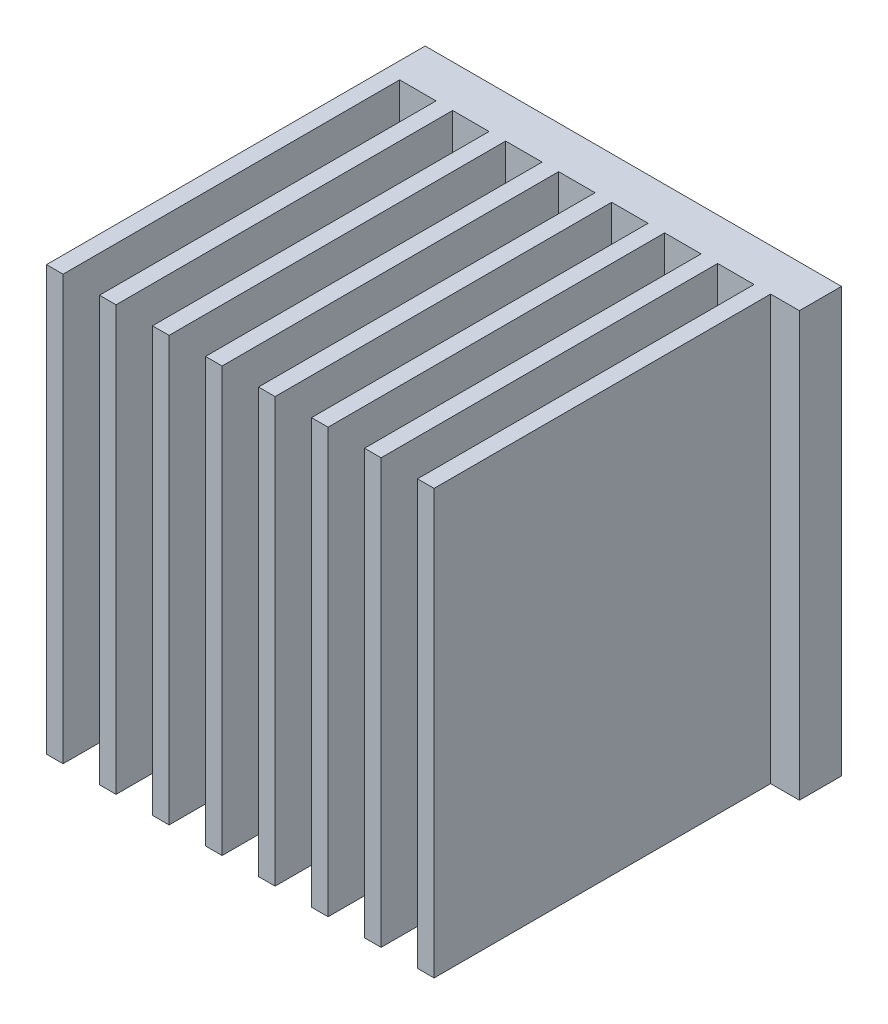
ISO-10303-21;
HEADER;
FILE_DESCRIPTION(('STEP AP214'),'2;1');
FILE_NAME('part.step','',(''),(''),'','','');
FILE_SCHEMA(('AUTOMOTIVE_DESIGN { 1 0 10303 214 1 1 1 1 }'));
ENDSEC;
DATA;
#1=APPLICATION_CONTEXT('core data for automotive mechanical design processes');
#2=APPLICATION_PROTOCOL_DEFINITION('international standard','automotive_design',2000,#1);
#3=PRODUCT_CONTEXT('',#1,'mechanical');
#4=PRODUCT('Part','Part','',(#3));
#5=PRODUCT_RELATED_PRODUCT_CATEGORY('part','',(#4));
#6=PRODUCT_DEFINITION_FORMATION('','',#4);
#7=PRODUCT_DEFINITION_CONTEXT('part definition',#1,'design');
#8=PRODUCT_DEFINITION('design','',#6,#7);
#9=PRODUCT_DEFINITION_SHAPE('','',#8);
#10=(LENGTH_UNIT() NAMED_UNIT(*) SI_UNIT(.MILLI.,.METRE.));
#11=(NAMED_UNIT(*) PLANE_ANGLE_UNIT() SI_UNIT($,.RADIAN.));
#12=(NAMED_UNIT(*) SI_UNIT($,.STERADIAN.) SOLID_ANGLE_UNIT());
#13=UNCERTAINTY_MEASURE_WITH_UNIT(LENGTH_MEASURE(1.E-05),#10,'distance_accuracy_value','');
#14=(GEOMETRIC_REPRESENTATION_CONTEXT(3) GLOBAL_UNCERTAINTY_ASSIGNED_CONTEXT((#13)) GLOBAL_UNIT_ASSIGNED_CONTEXT((#10,
#11,#12)) REPRESENTATION_CONTEXT('',''));
#15=CARTESIAN_POINT('',(0.,0.,0.));
#16=DIRECTION('',(0.,0.,1.));
#17=DIRECTION('',(1.,0.,0.));
#18=AXIS2_PLACEMENT_3D('',#15,#16,#17);
#19=CARTESIAN_POINT('',(0.,0.,3.175));
#20=DIRECTION('',(0.,0.,-1.));
#21=DIRECTION('',(-1.,0.,0.));
#22=AXIS2_PLACEMENT_3D('',#19,#20,#21);
#23=PLANE('',#22);
#24=DIRECTION('',(0.,-1.,0.));
#25=VECTOR('',#24,1.);
#26=CARTESIAN_POINT('',(12.29,16.,3.175));
#27=LINE('',#26,#25);
#28=CARTESIAN_POINT('',(12.29,16.,3.175));
#29=VERTEX_POINT('',#28);
#30=CARTESIAN_POINT('',(12.29,-16.,3.175));
#31=VERTEX_POINT('',#30);
#32=EDGE_CURVE('E60',#29,#31,#27,.T.);
#33=ORIENTED_EDGE('',*,*,#32,.F.);
#34=DIRECTION('',(-1.,0.,0.));
#35=VECTOR('',#34,1.);
#36=CARTESIAN_POINT('',(-15.71,16.,3.175));
#37=LINE('',#36,#35);
#38=CARTESIAN_POINT('',(9.54,16.,3.175));
#39=VERTEX_POINT('',#38);
#40=EDGE_CURVE('E482',#29,#39,#37,.T.);
#41=ORIENTED_EDGE('',*,*,#40,.T.);
#42=DIRECTION('',(0.,1.,0.));
#43=VECTOR('',#42,1.);
#44=CARTESIAN_POINT('',(9.53999999999999,16.,3.175));
#45=LINE('',#44,#43);
#46=CARTESIAN_POINT('',(9.54,-16.,3.175));
#47=VERTEX_POINT('',#46);
#48=EDGE_CURVE('E292',#47,#39,#45,.T.);
#49=ORIENTED_EDGE('',*,*,#48,.F.);
#50=DIRECTION('',(1.,0.,0.));
#51=VECTOR('',#50,1.);
#52=CARTESIAN_POINT('',(-15.71,-16.,3.175));
#53=LINE('',#52,#51);
#54=EDGE_CURVE('E515',#47,#31,#53,.T.);
#55=ORIENTED_EDGE('',*,*,#54,.T.);
#56=EDGE_LOOP('',(#33,#41,#49,#55));
#57=FACE_BOUND('',#56,.T.);
#58=ADVANCED_FACE('F45',(#57),#23,.F.);
#59=DIRECTION('',(0.,1.,0.));
#60=VECTOR('',#59,1.);
#61=CARTESIAN_POINT('',(13.54,16.,3.175));
#62=LINE('',#61,#60);
#63=CARTESIAN_POINT('',(13.54,-16.,3.175));
#64=VERTEX_POINT('',#63);
#65=CARTESIAN_POINT('',(13.54,16.,3.175));
#66=VERTEX_POINT('',#65);
#67=EDGE_CURVE('E286',#64,#66,#62,.T.);
#68=ORIENTED_EDGE('',*,*,#67,.F.);
#69=CARTESIAN_POINT('',(15.71,-16.,3.175));
#70=VERTEX_POINT('',#69);
#71=EDGE_CURVE('E481',#64,#70,#53,.T.);
#72=ORIENTED_EDGE('',*,*,#71,.T.);
#73=DIRECTION('',(0.,1.,0.));
#74=VECTOR('',#73,1.);
#75=CARTESIAN_POINT('',(15.71,-16.,3.175));
#76=LINE('',#75,#74);
#77=CARTESIAN_POINT('',(15.71,16.,3.175));
#78=VERTEX_POINT('',#77);
#79=EDGE_CURVE('E476',#70,#78,#76,.T.);
#80=ORIENTED_EDGE('',*,*,#79,.T.);
#81=EDGE_CURVE('E68',#78,#66,#37,.T.);
#82=ORIENTED_EDGE('',*,*,#81,.T.);
#83=EDGE_LOOP('',(#68,#72,#80,#82));
#84=FACE_BOUND('',#83,.T.);
#85=ADVANCED_FACE('F514',(#84),#23,.F.);
#86=DIRECTION('',(0.,-1.,0.));
#87=VECTOR('',#86,1.);
#88=CARTESIAN_POINT('',(8.29,16.,3.175));
#89=LINE('',#88,#87);
#90=CARTESIAN_POINT('',(8.29,16.,3.175));
#91=VERTEX_POINT('',#90);
#92=CARTESIAN_POINT('',(8.29,-16.,3.175));
#93=VERTEX_POINT('',#92);
#94=EDGE_CURVE('E289',#91,#93,#89,.T.);
#95=ORIENTED_EDGE('',*,*,#94,.F.);
#96=CARTESIAN_POINT('',(5.54,16.,3.175));
#97=VERTEX_POINT('',#96);
#98=EDGE_CURVE('E618',#91,#97,#37,.T.);
#99=ORIENTED_EDGE('',*,*,#98,.T.);
#100=DIRECTION('',(0.,1.,0.));
#101=VECTOR('',#100,1.);
#102=CARTESIAN_POINT('',(5.53999999999999,16.,3.175));
#103=LINE('',#102,#101);
#104=CARTESIAN_POINT('',(5.54,-16.,3.175));
#105=VERTEX_POINT('',#104);
#106=EDGE_CURVE('E326',#105,#97,#103,.T.);
#107=ORIENTED_EDGE('',*,*,#106,.F.);
#108=EDGE_CURVE('E516',#105,#93,#53,.T.);
#109=ORIENTED_EDGE('',*,*,#108,.T.);
#110=EDGE_LOOP('',(#95,#99,#107,#109));
#111=FACE_BOUND('',#110,.T.);
#112=ADVANCED_FACE('F582',(#111),#23,.F.);
#113=DIRECTION('',(0.,-1.,0.));
#114=VECTOR('',#113,1.);
#115=CARTESIAN_POINT('',(4.29,16.,3.175));
#116=LINE('',#115,#114);
#117=CARTESIAN_POINT('',(4.29,16.,3.175));
#118=VERTEX_POINT('',#117);
#119=CARTESIAN_POINT('',(4.29,-16.,3.175));
#120=VERTEX_POINT('',#119);
#121=EDGE_CURVE('E321',#118,#120,#116,.T.);
#122=ORIENTED_EDGE('',*,*,#121,.F.);
#123=CARTESIAN_POINT('',(1.54,16.,3.175));
#124=VERTEX_POINT('',#123);
#125=EDGE_CURVE('E617',#118,#124,#37,.T.);
#126=ORIENTED_EDGE('',*,*,#125,.T.);
#127=DIRECTION('',(0.,1.,0.));
#128=VECTOR('',#127,1.);
#129=CARTESIAN_POINT('',(1.53999999999999,16.,3.175));
#130=LINE('',#129,#128);
#131=CARTESIAN_POINT('',(1.54,-16.,3.175));
#132=VERTEX_POINT('',#131);
#133=EDGE_CURVE('E353',#132,#124,#130,.T.);
#134=ORIENTED_EDGE('',*,*,#133,.F.);
#135=EDGE_CURVE('E518',#132,#120,#53,.T.);
#136=ORIENTED_EDGE('',*,*,#135,.T.);
#137=EDGE_LOOP('',(#122,#126,#134,#136));
#138=FACE_BOUND('',#137,.T.);
#139=ADVANCED_FACE('F599',(#138),#23,.F.);
#140=DIRECTION('',(0.,-1.,0.));
#141=VECTOR('',#140,1.);
#142=CARTESIAN_POINT('',(0.289999999999995,16.,3.175));
#143=LINE('',#142,#141);
#144=CARTESIAN_POINT('',(0.289999999999995,16.,3.175));
#145=VERTEX_POINT('',#144);
#146=CARTESIAN_POINT('',(0.289999999999995,-16.,3.175));
#147=VERTEX_POINT('',#146);
#148=EDGE_CURVE('E348',#145,#147,#143,.T.);
#149=ORIENTED_EDGE('',*,*,#148,.F.);
#150=CARTESIAN_POINT('',(-2.46,16.,3.175));
#151=VERTEX_POINT('',#150);
#152=EDGE_CURVE('E546',#145,#151,#37,.T.);
#153=ORIENTED_EDGE('',*,*,#152,.T.);
#154=DIRECTION('',(0.,1.,0.));
#155=VECTOR('',#154,1.);
#156=CARTESIAN_POINT('',(-2.46000000000001,16.,3.175));
#157=LINE('',#156,#155);
#158=CARTESIAN_POINT('',(-2.46,-16.,3.175));
#159=VERTEX_POINT('',#158);
#160=EDGE_CURVE('E380',#159,#151,#157,.T.);
#161=ORIENTED_EDGE('',*,*,#160,.F.);
#162=EDGE_CURVE('E521',#159,#147,#53,.T.);
#163=ORIENTED_EDGE('',*,*,#162,.T.);
#164=EDGE_LOOP('',(#149,#153,#161,#163));
#165=FACE_BOUND('',#164,.T.);
#166=ADVANCED_FACE('F595',(#165),#23,.F.);
#167=DIRECTION('',(0.,-1.,0.));
#168=VECTOR('',#167,1.);
#169=CARTESIAN_POINT('',(-3.71,16.,3.175));
#170=LINE('',#169,#168);
#171=CARTESIAN_POINT('',(-3.71,16.,3.175));
#172=VERTEX_POINT('',#171);
#173=CARTESIAN_POINT('',(-3.71,-16.,3.175));
#174=VERTEX_POINT('',#173);
#175=EDGE_CURVE('E375',#172,#174,#170,.T.);
#176=ORIENTED_EDGE('',*,*,#175,.F.);
#177=CARTESIAN_POINT('',(-6.46,16.,3.175));
#178=VERTEX_POINT('',#177);
#179=EDGE_CURVE('E545',#172,#178,#37,.T.);
#180=ORIENTED_EDGE('',*,*,#179,.T.);
#181=DIRECTION('',(0.,1.,0.));
#182=VECTOR('',#181,1.);
#183=CARTESIAN_POINT('',(-6.46000000000001,16.,3.175));
#184=LINE('',#183,#182);
#185=CARTESIAN_POINT('',(-6.46,-16.,3.175));
#186=VERTEX_POINT('',#185);
#187=EDGE_CURVE('E407',#186,#178,#184,.T.);
#188=ORIENTED_EDGE('',*,*,#187,.F.);
#189=EDGE_CURVE('E524',#186,#174,#53,.T.);
#190=ORIENTED_EDGE('',*,*,#189,.T.);
#191=EDGE_LOOP('',(#176,#180,#188,#190));
#192=FACE_BOUND('',#191,.T.);
#193=ADVANCED_FACE('F591',(#192),#23,.F.);
#194=DIRECTION('',(0.,-1.,0.));
#195=VECTOR('',#194,1.);
#196=CARTESIAN_POINT('',(-7.71000000000001,16.,3.175));
#197=LINE('',#196,#195);
#198=CARTESIAN_POINT('',(-7.71000000000001,16.,3.175));
#199=VERTEX_POINT('',#198);
#200=CARTESIAN_POINT('',(-7.71000000000001,-16.,3.175));
#201=VERTEX_POINT('',#200);
#202=EDGE_CURVE('E402',#199,#201,#197,.T.);
#203=ORIENTED_EDGE('',*,*,#202,.F.);
#204=CARTESIAN_POINT('',(-10.46,16.,3.175));
#205=VERTEX_POINT('',#204);
#206=EDGE_CURVE('E542',#199,#205,#37,.T.);
#207=ORIENTED_EDGE('',*,*,#206,.T.);
#208=DIRECTION('',(0.,1.,0.));
#209=VECTOR('',#208,1.);
#210=CARTESIAN_POINT('',(-10.46,16.,3.175));
#211=LINE('',#210,#209);
#212=CARTESIAN_POINT('',(-10.46,-16.,3.175));
#213=VERTEX_POINT('',#212);
#214=EDGE_CURVE('E434',#213,#205,#211,.T.);
#215=ORIENTED_EDGE('',*,*,#214,.F.);
#216=EDGE_CURVE('E486',#213,#201,#53,.T.);
#217=ORIENTED_EDGE('',*,*,#216,.T.);
#218=EDGE_LOOP('',(#203,#207,#215,#217));
#219=FACE_BOUND('',#218,.T.);
#220=ADVANCED_FACE('F531',(#219),#23,.F.);
#221=DIRECTION('',(0.,-1.,0.));
#222=VECTOR('',#221,1.);
#223=CARTESIAN_POINT('',(-11.71,16.,3.175));
#224=LINE('',#223,#222);
#225=CARTESIAN_POINT('',(-11.71,16.,3.175));
#226=VERTEX_POINT('',#225);
#227=CARTESIAN_POINT('',(-11.71,-16.,3.175));
#228=VERTEX_POINT('',#227);
#229=EDGE_CURVE('E429',#226,#228,#224,.T.);
#230=ORIENTED_EDGE('',*,*,#229,.F.);
#231=CARTESIAN_POINT('',(-14.46,16.,3.175));
#232=VERTEX_POINT('',#231);
#233=EDGE_CURVE('E478',#226,#232,#37,.T.);
#234=ORIENTED_EDGE('',*,*,#233,.T.);
#235=DIRECTION('',(0.,1.,0.));
#236=VECTOR('',#235,1.);
#237=CARTESIAN_POINT('',(-14.46,16.,3.175));
#238=LINE('',#237,#236);
#239=CARTESIAN_POINT('',(-14.46,-16.,3.175));
#240=VERTEX_POINT('',#239);
#241=EDGE_CURVE('E456',#240,#232,#238,.T.);
#242=ORIENTED_EDGE('',*,*,#241,.F.);
#243=EDGE_CURVE('E483',#240,#228,#53,.T.);
#244=ORIENTED_EDGE('',*,*,#243,.T.);
#245=EDGE_LOOP('',(#230,#234,#242,#244));
#246=FACE_BOUND('',#245,.T.);
#247=ADVANCED_FACE('F549',(#246),#23,.F.);
#248=CARTESIAN_POINT('',(15.71,-16.,3.175));
#249=DIRECTION('',(-1.,0.,0.));
#250=DIRECTION('',(0.,0.,1.));
#251=AXIS2_PLACEMENT_3D('',#248,#249,#250);
#252=PLANE('',#251);
#253=DIRECTION('',(0.,1.,0.));
#254=VECTOR('',#253,1.);
#255=CARTESIAN_POINT('',(15.71,-16.,0.));
#256=LINE('',#255,#254);
#257=CARTESIAN_POINT('',(15.71,-16.,0.));
#258=VERTEX_POINT('',#257);
#259=CARTESIAN_POINT('',(15.71,16.,0.));
#260=VERTEX_POINT('',#259);
#261=EDGE_CURVE('E475',#258,#260,#256,.T.);
#262=ORIENTED_EDGE('',*,*,#261,.T.);
#263=DIRECTION('',(0.,0.,-1.));
#264=VECTOR('',#263,1.);
#265=CARTESIAN_POINT('',(15.71,16.,3.175));
#266=LINE('',#265,#264);
#267=EDGE_CURVE('E11',#78,#260,#266,.T.);
#268=ORIENTED_EDGE('',*,*,#267,.F.);
#269=ORIENTED_EDGE('',*,*,#79,.F.);
#270=DIRECTION('',(0.,0.,-1.));
#271=VECTOR('',#270,1.);
#272=CARTESIAN_POINT('',(15.71,-16.,3.175));
#273=LINE('',#272,#271);
#274=EDGE_CURVE('E485',#70,#258,#273,.T.);
#275=ORIENTED_EDGE('',*,*,#274,.T.);
#276=EDGE_LOOP('',(#262,#268,#269,#275));
#277=FACE_BOUND('',#276,.T.);
#278=ADVANCED_FACE('F47',(#277),#252,.F.);
#279=CARTESIAN_POINT('',(-15.71,16.,3.175));
#280=DIRECTION('',(0.,-1.,0.));
#281=DIRECTION('',(0.,0.,-1.));
#282=AXIS2_PLACEMENT_3D('',#279,#280,#281);
#283=PLANE('',#282);
#284=DIRECTION('',(-1.,0.,0.));
#285=VECTOR('',#284,1.);
#286=CARTESIAN_POINT('',(-15.71,16.,0.));
#287=LINE('',#286,#285);
#288=CARTESIAN_POINT('',(-15.71,16.,0.));
#289=VERTEX_POINT('',#288);
#290=EDGE_CURVE('E489',#260,#289,#287,.T.);
#291=ORIENTED_EDGE('',*,*,#290,.T.);
#292=DIRECTION('',(0.,0.,-1.));
#293=VECTOR('',#292,1.);
#294=CARTESIAN_POINT('',(-15.71,16.,3.175));
#295=LINE('',#294,#293);
#296=CARTESIAN_POINT('',(-15.71,16.,28.575));
#297=VERTEX_POINT('',#296);
#298=EDGE_CURVE('E53',#297,#289,#295,.T.);
#299=ORIENTED_EDGE('',*,*,#298,.F.);
#300=DIRECTION('',(-1.,0.,0.));
#301=VECTOR('',#300,1.);
#302=CARTESIAN_POINT('',(-15.71,16.,28.575));
#303=LINE('',#302,#301);
#304=CARTESIAN_POINT('',(-14.46,16.,28.575));
#305=VERTEX_POINT('',#304);
#306=EDGE_CURVE('E464',#305,#297,#303,.T.);
#307=ORIENTED_EDGE('',*,*,#306,.F.);
#308=DIRECTION('',(0.,0.,-1.));
#309=VECTOR('',#308,1.);
#310=CARTESIAN_POINT('',(-14.46,16.,28.575));
#311=LINE('',#310,#309);
#312=EDGE_CURVE('E467',#305,#232,#311,.T.);
#313=ORIENTED_EDGE('',*,*,#312,.T.);
#314=ORIENTED_EDGE('',*,*,#233,.F.);
#315=DIRECTION('',(0.,0.,-1.));
#316=VECTOR('',#315,1.);
#317=CARTESIAN_POINT('',(-11.71,16.,28.575));
#318=LINE('',#317,#316);
#319=CARTESIAN_POINT('',(-11.71,16.,28.575));
#320=VERTEX_POINT('',#319);
#321=EDGE_CURVE('E440',#320,#226,#318,.T.);
#322=ORIENTED_EDGE('',*,*,#321,.F.);
#323=DIRECTION('',(-1.,0.,0.));
#324=VECTOR('',#323,1.);
#325=CARTESIAN_POINT('',(-11.71,16.,28.575));
#326=LINE('',#325,#324);
#327=CARTESIAN_POINT('',(-10.46,16.,28.575));
#328=VERTEX_POINT('',#327);
#329=EDGE_CURVE('E438',#328,#320,#326,.T.);
#330=ORIENTED_EDGE('',*,*,#329,.F.);
#331=DIRECTION('',(0.,0.,-1.));
#332=VECTOR('',#331,1.);
#333=CARTESIAN_POINT('',(-10.46,16.,28.575));
#334=LINE('',#333,#332);
#335=EDGE_CURVE('E447',#328,#205,#334,.T.);
#336=ORIENTED_EDGE('',*,*,#335,.T.);
#337=ORIENTED_EDGE('',*,*,#206,.F.);
#338=DIRECTION('',(0.,0.,-1.));
#339=VECTOR('',#338,1.);
#340=CARTESIAN_POINT('',(-7.71000000000001,16.,28.575));
#341=LINE('',#340,#339);
#342=CARTESIAN_POINT('',(-7.71000000000001,16.,28.575));
#343=VERTEX_POINT('',#342);
#344=EDGE_CURVE('E413',#343,#199,#341,.T.);
#345=ORIENTED_EDGE('',*,*,#344,.F.);
#346=DIRECTION('',(-1.,0.,0.));
#347=VECTOR('',#346,1.);
#348=CARTESIAN_POINT('',(-7.71000000000001,16.,28.575));
#349=LINE('',#348,#347);
#350=CARTESIAN_POINT('',(-6.46000000000001,16.,28.575));
#351=VERTEX_POINT('',#350);
#352=EDGE_CURVE('E411',#351,#343,#349,.T.);
#353=ORIENTED_EDGE('',*,*,#352,.F.);
#354=DIRECTION('',(0.,0.,-1.));
#355=VECTOR('',#354,1.);
#356=CARTESIAN_POINT('',(-6.46000000000001,16.,28.575));
#357=LINE('',#356,#355);
#358=EDGE_CURVE('E420',#351,#178,#357,.T.);
#359=ORIENTED_EDGE('',*,*,#358,.T.);
#360=ORIENTED_EDGE('',*,*,#179,.F.);
#361=DIRECTION('',(0.,0.,-1.));
#362=VECTOR('',#361,1.);
#363=CARTESIAN_POINT('',(-3.71,16.,28.575));
#364=LINE('',#363,#362);
#365=CARTESIAN_POINT('',(-3.71,16.,28.575));
#366=VERTEX_POINT('',#365);
#367=EDGE_CURVE('E386',#366,#172,#364,.T.);
#368=ORIENTED_EDGE('',*,*,#367,.F.);
#369=DIRECTION('',(-1.,0.,0.));
#370=VECTOR('',#369,1.);
#371=CARTESIAN_POINT('',(-3.71,16.,28.575));
#372=LINE('',#371,#370);
#373=CARTESIAN_POINT('',(-2.46000000000001,16.,28.575));
#374=VERTEX_POINT('',#373);
#375=EDGE_CURVE('E384',#374,#366,#372,.T.);
#376=ORIENTED_EDGE('',*,*,#375,.F.);
#377=DIRECTION('',(0.,0.,-1.));
#378=VECTOR('',#377,1.);
#379=CARTESIAN_POINT('',(-2.46000000000001,16.,28.575));
#380=LINE('',#379,#378);
#381=EDGE_CURVE('E393',#374,#151,#380,.T.);
#382=ORIENTED_EDGE('',*,*,#381,.T.);
#383=ORIENTED_EDGE('',*,*,#152,.F.);
#384=DIRECTION('',(0.,0.,-1.));
#385=VECTOR('',#384,1.);
#386=CARTESIAN_POINT('',(0.289999999999995,16.,28.575));
#387=LINE('',#386,#385);
#388=CARTESIAN_POINT('',(0.289999999999995,16.,28.575));
#389=VERTEX_POINT('',#388);
#390=EDGE_CURVE('E359',#389,#145,#387,.T.);
#391=ORIENTED_EDGE('',*,*,#390,.F.);
#392=DIRECTION('',(-1.,0.,0.));
#393=VECTOR('',#392,1.);
#394=CARTESIAN_POINT('',(0.289999999999995,16.,28.575));
#395=LINE('',#394,#393);
#396=CARTESIAN_POINT('',(1.53999999999999,16.,28.575));
#397=VERTEX_POINT('',#396);
#398=EDGE_CURVE('E357',#397,#389,#395,.T.);
#399=ORIENTED_EDGE('',*,*,#398,.F.);
#400=DIRECTION('',(0.,0.,-1.));
#401=VECTOR('',#400,1.);
#402=CARTESIAN_POINT('',(1.53999999999999,16.,28.575));
#403=LINE('',#402,#401);
#404=EDGE_CURVE('E366',#397,#124,#403,.T.);
#405=ORIENTED_EDGE('',*,*,#404,.T.);
#406=ORIENTED_EDGE('',*,*,#125,.F.);
#407=DIRECTION('',(0.,0.,-1.));
#408=VECTOR('',#407,1.);
#409=CARTESIAN_POINT('',(4.29,16.,28.575));
#410=LINE('',#409,#408);
#411=CARTESIAN_POINT('',(4.29,16.,28.575));
#412=VERTEX_POINT('',#411);
#413=EDGE_CURVE('E332',#412,#118,#410,.T.);
#414=ORIENTED_EDGE('',*,*,#413,.F.);
#415=DIRECTION('',(-1.,0.,0.));
#416=VECTOR('',#415,1.);
#417=CARTESIAN_POINT('',(4.29,16.,28.575));
#418=LINE('',#417,#416);
#419=CARTESIAN_POINT('',(5.53999999999999,16.,28.575));
#420=VERTEX_POINT('',#419);
#421=EDGE_CURVE('E330',#420,#412,#418,.T.);
#422=ORIENTED_EDGE('',*,*,#421,.F.);
#423=DIRECTION('',(0.,0.,-1.));
#424=VECTOR('',#423,1.);
#425=CARTESIAN_POINT('',(5.53999999999999,16.,28.575));
#426=LINE('',#425,#424);
#427=EDGE_CURVE('E339',#420,#97,#426,.T.);
#428=ORIENTED_EDGE('',*,*,#427,.T.);
#429=ORIENTED_EDGE('',*,*,#98,.F.);
#430=DIRECTION('',(0.,0.,-1.));
#431=VECTOR('',#430,1.);
#432=CARTESIAN_POINT('',(8.29,16.,28.575));
#433=LINE('',#432,#431);
#434=CARTESIAN_POINT('',(8.29,16.,28.575));
#435=VERTEX_POINT('',#434);
#436=EDGE_CURVE('E306',#435,#91,#433,.T.);
#437=ORIENTED_EDGE('',*,*,#436,.F.);
#438=DIRECTION('',(-1.,0.,0.));
#439=VECTOR('',#438,1.);
#440=CARTESIAN_POINT('',(8.29,16.,28.575));
#441=LINE('',#440,#439);
#442=CARTESIAN_POINT('',(9.53999999999999,16.,28.575));
#443=VERTEX_POINT('',#442);
#444=EDGE_CURVE('E305',#443,#435,#441,.T.);
#445=ORIENTED_EDGE('',*,*,#444,.F.);
#446=DIRECTION('',(0.,0.,-1.));
#447=VECTOR('',#446,1.);
#448=CARTESIAN_POINT('',(9.53999999999999,16.,28.575));
#449=LINE('',#448,#447);
#450=EDGE_CURVE('E312',#443,#39,#449,.T.);
#451=ORIENTED_EDGE('',*,*,#450,.T.);
#452=ORIENTED_EDGE('',*,*,#40,.F.);
#453=DIRECTION('',(0.,0.,-1.));
#454=VECTOR('',#453,1.);
#455=CARTESIAN_POINT('',(12.29,16.,28.575));
#456=LINE('',#455,#454);
#457=CARTESIAN_POINT('',(12.29,16.,28.575));
#458=VERTEX_POINT('',#457);
#459=EDGE_CURVE('E809',#458,#29,#456,.T.);
#460=ORIENTED_EDGE('',*,*,#459,.F.);
#461=DIRECTION('',(-1.,0.,0.));
#462=VECTOR('',#461,1.);
#463=CARTESIAN_POINT('',(12.29,16.,28.575));
#464=LINE('',#463,#462);
#465=CARTESIAN_POINT('',(13.54,16.,28.575));
#466=VERTEX_POINT('',#465);
#467=EDGE_CURVE('E282',#466,#458,#464,.T.);
#468=ORIENTED_EDGE('',*,*,#467,.F.);
#469=DIRECTION('',(0.,0.,-1.));
#470=VECTOR('',#469,1.);
#471=CARTESIAN_POINT('',(13.54,16.,28.575));
#472=LINE('',#471,#470);
#473=EDGE_CURVE('E294',#466,#66,#472,.T.);
#474=ORIENTED_EDGE('',*,*,#473,.T.);
#475=ORIENTED_EDGE('',*,*,#81,.F.);
#476=ORIENTED_EDGE('',*,*,#267,.T.);
#477=EDGE_LOOP('',(#291,#299,#307,#313,#314,#322,#330,#336,#337,#345,#353,#359,#360,#368,#376,
#382,#383,#391,#399,#405,#406,#414,#422,#428,#429,#437,#445,#451,#452,#460,#468,#474,#475,#476));
#478=FACE_BOUND('',#477,.T.);
#479=ADVANCED_FACE('F541',(#478),#283,.F.);
#480=CARTESIAN_POINT('',(-15.71,-16.,3.175));
#481=DIRECTION('',(1.,0.,0.));
#482=DIRECTION('',(0.,0.,-1.));
#483=AXIS2_PLACEMENT_3D('',#480,#481,#482);
#484=PLANE('',#483);
#485=DIRECTION('',(0.,-1.,0.));
#486=VECTOR('',#485,1.);
#487=CARTESIAN_POINT('',(-15.71,-16.,0.));
#488=LINE('',#487,#486);
#489=CARTESIAN_POINT('',(-15.71,-16.,0.));
#490=VERTEX_POINT('',#489);
#491=EDGE_CURVE('E491',#289,#490,#488,.T.);
#492=ORIENTED_EDGE('',*,*,#491,.T.);
#493=DIRECTION('',(0.,0.,-1.));
#494=VECTOR('',#493,1.);
#495=CARTESIAN_POINT('',(-15.71,-16.,3.175));
#496=LINE('',#495,#494);
#497=CARTESIAN_POINT('',(-15.71,-16.,28.575));
#498=VERTEX_POINT('',#497);
#499=EDGE_CURVE('E496',#498,#490,#496,.T.);
#500=ORIENTED_EDGE('',*,*,#499,.F.);
#501=DIRECTION('',(0.,-1.,0.));
#502=VECTOR('',#501,1.);
#503=CARTESIAN_POINT('',(-15.71,16.,28.575));
#504=LINE('',#503,#502);
#505=EDGE_CURVE('E457',#297,#498,#504,.T.);
#506=ORIENTED_EDGE('',*,*,#505,.F.);
#507=ORIENTED_EDGE('',*,*,#298,.T.);
#508=EDGE_LOOP('',(#492,#500,#506,#507));
#509=FACE_BOUND('',#508,.T.);
#510=ADVANCED_FACE('F502',(#509),#484,.F.);
#511=CARTESIAN_POINT('',(-15.71,-16.,3.175));
#512=DIRECTION('',(0.,1.,0.));
#513=DIRECTION('',(0.,0.,1.));
#514=AXIS2_PLACEMENT_3D('',#511,#512,#513);
#515=PLANE('',#514);
#516=DIRECTION('',(1.,0.,0.));
#517=VECTOR('',#516,1.);
#518=CARTESIAN_POINT('',(-15.71,-16.,0.));
#519=LINE('',#518,#517);
#520=EDGE_CURVE('E479',#490,#258,#519,.T.);
#521=ORIENTED_EDGE('',*,*,#520,.T.);
#522=ORIENTED_EDGE('',*,*,#274,.F.);
#523=ORIENTED_EDGE('',*,*,#71,.F.);
#524=DIRECTION('',(0.,0.,-1.));
#525=VECTOR('',#524,1.);
#526=CARTESIAN_POINT('',(13.54,-16.,28.575));
#527=LINE('',#526,#525);
#528=CARTESIAN_POINT('',(13.54,-16.,28.575));
#529=VERTEX_POINT('',#528);
#530=EDGE_CURVE('E273',#529,#64,#527,.T.);
#531=ORIENTED_EDGE('',*,*,#530,.F.);
#532=DIRECTION('',(1.,0.,0.));
#533=VECTOR('',#532,1.);
#534=CARTESIAN_POINT('',(12.29,-16.,28.575));
#535=LINE('',#534,#533);
#536=CARTESIAN_POINT('',(12.29,-16.,28.575));
#537=VERTEX_POINT('',#536);
#538=EDGE_CURVE('E267',#537,#529,#535,.T.);
#539=ORIENTED_EDGE('',*,*,#538,.F.);
#540=DIRECTION('',(0.,0.,-1.));
#541=VECTOR('',#540,1.);
#542=CARTESIAN_POINT('',(12.29,-16.,28.575));
#543=LINE('',#542,#541);
#544=EDGE_CURVE('E271',#537,#31,#543,.T.);
#545=ORIENTED_EDGE('',*,*,#544,.T.);
#546=ORIENTED_EDGE('',*,*,#54,.F.);
#547=DIRECTION('',(0.,0.,-1.));
#548=VECTOR('',#547,1.);
#549=CARTESIAN_POINT('',(9.54,-16.,28.575));
#550=LINE('',#549,#548);
#551=CARTESIAN_POINT('',(9.54,-16.,28.575));
#552=VERTEX_POINT('',#551);
#553=EDGE_CURVE('E315',#552,#47,#550,.T.);
#554=ORIENTED_EDGE('',*,*,#553,.F.);
#555=DIRECTION('',(1.,0.,0.));
#556=VECTOR('',#555,1.);
#557=CARTESIAN_POINT('',(8.29,-16.,28.575));
#558=LINE('',#557,#556);
#559=CARTESIAN_POINT('',(8.29,-16.,28.575));
#560=VERTEX_POINT('',#559);
#561=EDGE_CURVE('E301',#560,#552,#558,.T.);
#562=ORIENTED_EDGE('',*,*,#561,.F.);
#563=DIRECTION('',(0.,0.,-1.));
#564=VECTOR('',#563,1.);
#565=CARTESIAN_POINT('',(8.29,-16.,28.575));
#566=LINE('',#565,#564);
#567=EDGE_CURVE('E318',#560,#93,#566,.T.);
#568=ORIENTED_EDGE('',*,*,#567,.T.);
#569=ORIENTED_EDGE('',*,*,#108,.F.);
#570=DIRECTION('',(0.,0.,-1.));
#571=VECTOR('',#570,1.);
#572=CARTESIAN_POINT('',(5.54,-16.,28.575));
#573=LINE('',#572,#571);
#574=CARTESIAN_POINT('',(5.54,-16.,28.575));
#575=VERTEX_POINT('',#574);
#576=EDGE_CURVE('E342',#575,#105,#573,.T.);
#577=ORIENTED_EDGE('',*,*,#576,.F.);
#578=DIRECTION('',(1.,0.,0.));
#579=VECTOR('',#578,1.);
#580=CARTESIAN_POINT('',(4.29,-16.,28.575));
#581=LINE('',#580,#579);
#582=CARTESIAN_POINT('',(4.29,-16.,28.575));
#583=VERTEX_POINT('',#582);
#584=EDGE_CURVE('E325',#583,#575,#581,.T.);
#585=ORIENTED_EDGE('',*,*,#584,.F.);
#586=DIRECTION('',(0.,0.,-1.));
#587=VECTOR('',#586,1.);
#588=CARTESIAN_POINT('',(4.29,-16.,28.575));
#589=LINE('',#588,#587);
#590=EDGE_CURVE('E345',#583,#120,#589,.T.);
#591=ORIENTED_EDGE('',*,*,#590,.T.);
#592=ORIENTED_EDGE('',*,*,#135,.F.);
#593=DIRECTION('',(0.,0.,-1.));
#594=VECTOR('',#593,1.);
#595=CARTESIAN_POINT('',(1.54,-16.,28.575));
#596=LINE('',#595,#594);
#597=CARTESIAN_POINT('',(1.54,-16.,28.575));
#598=VERTEX_POINT('',#597);
#599=EDGE_CURVE('E369',#598,#132,#596,.T.);
#600=ORIENTED_EDGE('',*,*,#599,.F.);
#601=DIRECTION('',(1.,0.,0.));
#602=VECTOR('',#601,1.);
#603=CARTESIAN_POINT('',(0.289999999999995,-16.,28.575));
#604=LINE('',#603,#602);
#605=CARTESIAN_POINT('',(0.289999999999995,-16.,28.575));
#606=VERTEX_POINT('',#605);
#607=EDGE_CURVE('E352',#606,#598,#604,.T.);
#608=ORIENTED_EDGE('',*,*,#607,.F.);
#609=DIRECTION('',(0.,0.,-1.));
#610=VECTOR('',#609,1.);
#611=CARTESIAN_POINT('',(0.289999999999995,-16.,28.575));
#612=LINE('',#611,#610);
#613=EDGE_CURVE('E372',#606,#147,#612,.T.);
#614=ORIENTED_EDGE('',*,*,#613,.T.);
#615=ORIENTED_EDGE('',*,*,#162,.F.);
#616=DIRECTION('',(0.,0.,-1.));
#617=VECTOR('',#616,1.);
#618=CARTESIAN_POINT('',(-2.46,-16.,28.575));
#619=LINE('',#618,#617);
#620=CARTESIAN_POINT('',(-2.46,-16.,28.575));
#621=VERTEX_POINT('',#620);
#622=EDGE_CURVE('E396',#621,#159,#619,.T.);
#623=ORIENTED_EDGE('',*,*,#622,.F.);
#624=DIRECTION('',(1.,0.,0.));
#625=VECTOR('',#624,1.);
#626=CARTESIAN_POINT('',(-3.71,-16.,28.575));
#627=LINE('',#626,#625);
#628=CARTESIAN_POINT('',(-3.71,-16.,28.575));
#629=VERTEX_POINT('',#628);
#630=EDGE_CURVE('E379',#629,#621,#627,.T.);
#631=ORIENTED_EDGE('',*,*,#630,.F.);
#632=DIRECTION('',(0.,0.,-1.));
#633=VECTOR('',#632,1.);
#634=CARTESIAN_POINT('',(-3.71,-16.,28.575));
#635=LINE('',#634,#633);
#636=EDGE_CURVE('E399',#629,#174,#635,.T.);
#637=ORIENTED_EDGE('',*,*,#636,.T.);
#638=ORIENTED_EDGE('',*,*,#189,.F.);
#639=DIRECTION('',(0.,0.,-1.));
#640=VECTOR('',#639,1.);
#641=CARTESIAN_POINT('',(-6.46,-16.,28.575));
#642=LINE('',#641,#640);
#643=CARTESIAN_POINT('',(-6.46,-16.,28.575));
#644=VERTEX_POINT('',#643);
#645=EDGE_CURVE('E423',#644,#186,#642,.T.);
#646=ORIENTED_EDGE('',*,*,#645,.F.);
#647=DIRECTION('',(1.,0.,0.));
#648=VECTOR('',#647,1.);
#649=CARTESIAN_POINT('',(-7.71000000000001,-16.,28.575));
#650=LINE('',#649,#648);
#651=CARTESIAN_POINT('',(-7.71000000000001,-16.,28.575));
#652=VERTEX_POINT('',#651);
#653=EDGE_CURVE('E406',#652,#644,#650,.T.);
#654=ORIENTED_EDGE('',*,*,#653,.F.);
#655=DIRECTION('',(0.,0.,-1.));
#656=VECTOR('',#655,1.);
#657=CARTESIAN_POINT('',(-7.71000000000001,-16.,28.575));
#658=LINE('',#657,#656);
#659=EDGE_CURVE('E426',#652,#201,#658,.T.);
#660=ORIENTED_EDGE('',*,*,#659,.T.);
#661=ORIENTED_EDGE('',*,*,#216,.F.);
#662=DIRECTION('',(0.,0.,-1.));
#663=VECTOR('',#662,1.);
#664=CARTESIAN_POINT('',(-10.46,-16.,28.575));
#665=LINE('',#664,#663);
#666=CARTESIAN_POINT('',(-10.46,-16.,28.575));
#667=VERTEX_POINT('',#666);
#668=EDGE_CURVE('E450',#667,#213,#665,.T.);
#669=ORIENTED_EDGE('',*,*,#668,.F.);
#670=DIRECTION('',(1.,0.,0.));
#671=VECTOR('',#670,1.);
#672=CARTESIAN_POINT('',(-11.71,-16.,28.575));
#673=LINE('',#672,#671);
#674=CARTESIAN_POINT('',(-11.71,-16.,28.575));
#675=VERTEX_POINT('',#674);
#676=EDGE_CURVE('E433',#675,#667,#673,.T.);
#677=ORIENTED_EDGE('',*,*,#676,.F.);
#678=DIRECTION('',(0.,0.,-1.));
#679=VECTOR('',#678,1.);
#680=CARTESIAN_POINT('',(-11.71,-16.,28.575));
#681=LINE('',#680,#679);
#682=EDGE_CURVE('E453',#675,#228,#681,.T.);
#683=ORIENTED_EDGE('',*,*,#682,.T.);
#684=ORIENTED_EDGE('',*,*,#243,.F.);
#685=DIRECTION('',(0.,0.,-1.));
#686=VECTOR('',#685,1.);
#687=CARTESIAN_POINT('',(-14.46,-16.,28.575));
#688=LINE('',#687,#686);
#689=CARTESIAN_POINT('',(-14.46,-16.,28.575));
#690=VERTEX_POINT('',#689);
#691=EDGE_CURVE('E472',#690,#240,#688,.T.);
#692=ORIENTED_EDGE('',*,*,#691,.F.);
#693=DIRECTION('',(1.,0.,0.));
#694=VECTOR('',#693,1.);
#695=CARTESIAN_POINT('',(-15.71,-16.,28.575));
#696=LINE('',#695,#694);
#697=EDGE_CURVE('E460',#498,#690,#696,.T.);
#698=ORIENTED_EDGE('',*,*,#697,.F.);
#699=ORIENTED_EDGE('',*,*,#499,.T.);
#700=EDGE_LOOP('',(#521,#522,#523,#531,#539,#545,#546,#554,#562,#568,#569,#577,#585,#591,#592,
#600,#608,#614,#615,#623,#631,#637,#638,#646,#654,#660,#661,#669,#677,#683,#684,#692,#698,#699));
#701=FACE_BOUND('',#700,.T.);
#702=ADVANCED_FACE('F269',(#701),#515,.F.);
#703=CARTESIAN_POINT('',(0.,0.,0.));
#704=DIRECTION('',(0.,0.,-1.));
#705=DIRECTION('',(-1.,0.,0.));
#706=AXIS2_PLACEMENT_3D('',#703,#704,#705);
#707=PLANE('',#706);
#708=ORIENTED_EDGE('',*,*,#261,.F.);
#709=ORIENTED_EDGE('',*,*,#520,.F.);
#710=ORIENTED_EDGE('',*,*,#491,.F.);
#711=ORIENTED_EDGE('',*,*,#290,.F.);
#712=EDGE_LOOP('',(#708,#709,#710,#711));
#713=FACE_BOUND('',#712,.T.);
#714=ADVANCED_FACE('F508',(#713),#707,.T.);
#715=CARTESIAN_POINT('',(-14.46,16.,28.575));
#716=DIRECTION('',(-1.,0.,0.));
#717=DIRECTION('',(0.,-1.,0.));
#718=AXIS2_PLACEMENT_3D('',#715,#716,#717);
#719=PLANE('',#718);
#720=ORIENTED_EDGE('',*,*,#241,.T.);
#721=ORIENTED_EDGE('',*,*,#312,.F.);
#722=DIRECTION('',(0.,1.,0.));
#723=VECTOR('',#722,1.);
#724=CARTESIAN_POINT('',(-14.46,16.,28.575));
#725=LINE('',#724,#723);
#726=EDGE_CURVE('E462',#690,#305,#725,.T.);
#727=ORIENTED_EDGE('',*,*,#726,.F.);
#728=ORIENTED_EDGE('',*,*,#691,.T.);
#729=EDGE_LOOP('',(#720,#721,#727,#728));
#730=FACE_BOUND('',#729,.T.);
#731=ADVANCED_FACE('F554',(#730),#719,.F.);
#732=CARTESIAN_POINT('',(0.,0.,28.575));
#733=DIRECTION('',(0.,0.,1.));
#734=DIRECTION('',(1.,0.,0.));
#735=AXIS2_PLACEMENT_3D('',#732,#733,#734);
#736=PLANE('',#735);
#737=ORIENTED_EDGE('',*,*,#505,.T.);
#738=ORIENTED_EDGE('',*,*,#697,.T.);
#739=ORIENTED_EDGE('',*,*,#726,.T.);
#740=ORIENTED_EDGE('',*,*,#306,.T.);
#741=EDGE_LOOP('',(#737,#738,#739,#740));
#742=FACE_BOUND('',#741,.T.);
#743=ADVANCED_FACE('F558',(#742),#736,.T.);
#744=CARTESIAN_POINT('',(-11.71,16.,28.575));
#745=DIRECTION('',(1.,0.,0.));
#746=DIRECTION('',(0.,0.,-1.));
#747=AXIS2_PLACEMENT_3D('',#744,#745,#746);
#748=PLANE('',#747);
#749=ORIENTED_EDGE('',*,*,#229,.T.);
#750=ORIENTED_EDGE('',*,*,#682,.F.);
#751=DIRECTION('',(0.,-1.,0.));
#752=VECTOR('',#751,1.);
#753=CARTESIAN_POINT('',(-11.71,16.,28.575));
#754=LINE('',#753,#752);
#755=EDGE_CURVE('E430',#320,#675,#754,.T.);
#756=ORIENTED_EDGE('',*,*,#755,.F.);
#757=ORIENTED_EDGE('',*,*,#321,.T.);
#758=EDGE_LOOP('',(#749,#750,#756,#757));
#759=FACE_BOUND('',#758,.T.);
#760=ADVANCED_FACE('F562',(#759),#748,.F.);
#761=CARTESIAN_POINT('',(-10.46,16.,28.575));
#762=DIRECTION('',(-1.,0.,0.));
#763=DIRECTION('',(0.,-1.,0.));
#764=AXIS2_PLACEMENT_3D('',#761,#762,#763);
#765=PLANE('',#764);
#766=ORIENTED_EDGE('',*,*,#214,.T.);
#767=ORIENTED_EDGE('',*,*,#335,.F.);
#768=DIRECTION('',(0.,1.,0.));
#769=VECTOR('',#768,1.);
#770=CARTESIAN_POINT('',(-10.46,16.,28.575));
#771=LINE('',#770,#769);
#772=EDGE_CURVE('E436',#667,#328,#771,.T.);
#773=ORIENTED_EDGE('',*,*,#772,.F.);
#774=ORIENTED_EDGE('',*,*,#668,.T.);
#775=EDGE_LOOP('',(#766,#767,#773,#774));
#776=FACE_BOUND('',#775,.T.);
#777=ADVANCED_FACE('F567',(#776),#765,.F.);
#778=CARTESIAN_POINT('',(4.,0.,28.575));
#779=DIRECTION('',(0.,0.,1.));
#780=DIRECTION('',(1.,0.,0.));
#781=AXIS2_PLACEMENT_3D('',#778,#779,#780);
#782=PLANE('',#781);
#783=ORIENTED_EDGE('',*,*,#755,.T.);
#784=ORIENTED_EDGE('',*,*,#676,.T.);
#785=ORIENTED_EDGE('',*,*,#772,.T.);
#786=ORIENTED_EDGE('',*,*,#329,.T.);
#787=EDGE_LOOP('',(#783,#784,#785,#786));
#788=FACE_BOUND('',#787,.T.);
#789=ADVANCED_FACE('F564',(#788),#782,.T.);
#790=CARTESIAN_POINT('',(-7.71000000000001,16.,28.575));
#791=DIRECTION('',(1.,0.,0.));
#792=DIRECTION('',(0.,0.,-1.));
#793=AXIS2_PLACEMENT_3D('',#790,#791,#792);
#794=PLANE('',#793);
#795=ORIENTED_EDGE('',*,*,#202,.T.);
#796=ORIENTED_EDGE('',*,*,#659,.F.);
#797=DIRECTION('',(0.,-1.,0.));
#798=VECTOR('',#797,1.);
#799=CARTESIAN_POINT('',(-7.71000000000001,16.,28.575));
#800=LINE('',#799,#798);
#801=EDGE_CURVE('E403',#343,#652,#800,.T.);
#802=ORIENTED_EDGE('',*,*,#801,.F.);
#803=ORIENTED_EDGE('',*,*,#344,.T.);
#804=EDGE_LOOP('',(#795,#796,#802,#803));
#805=FACE_BOUND('',#804,.T.);
#806=ADVANCED_FACE('F538',(#805),#794,.F.);
#807=CARTESIAN_POINT('',(-6.46000000000001,16.,28.575));
#808=DIRECTION('',(-1.,0.,0.));
#809=DIRECTION('',(0.,-1.,0.));
#810=AXIS2_PLACEMENT_3D('',#807,#808,#809);
#811=PLANE('',#810);
#812=ORIENTED_EDGE('',*,*,#187,.T.);
#813=ORIENTED_EDGE('',*,*,#358,.F.);
#814=DIRECTION('',(0.,1.,0.));
#815=VECTOR('',#814,1.);
#816=CARTESIAN_POINT('',(-6.46000000000001,16.,28.575));
#817=LINE('',#816,#815);
#818=EDGE_CURVE('E409',#644,#351,#817,.T.);
#819=ORIENTED_EDGE('',*,*,#818,.F.);
#820=ORIENTED_EDGE('',*,*,#645,.T.);
#821=EDGE_LOOP('',(#812,#813,#819,#820));
#822=FACE_BOUND('',#821,.T.);
#823=ADVANCED_FACE('F676',(#822),#811,.F.);
#824=CARTESIAN_POINT('',(8.,0.,28.575));
#825=DIRECTION('',(0.,0.,1.));
#826=DIRECTION('',(1.,0.,0.));
#827=AXIS2_PLACEMENT_3D('',#824,#825,#826);
#828=PLANE('',#827);
#829=ORIENTED_EDGE('',*,*,#801,.T.);
#830=ORIENTED_EDGE('',*,*,#653,.T.);
#831=ORIENTED_EDGE('',*,*,#818,.T.);
#832=ORIENTED_EDGE('',*,*,#352,.T.);
#833=EDGE_LOOP('',(#829,#830,#831,#832));
#834=FACE_BOUND('',#833,.T.);
#835=ADVANCED_FACE('F673',(#834),#828,.T.);
#836=CARTESIAN_POINT('',(-3.71,16.,28.575));
#837=DIRECTION('',(1.,0.,0.));
#838=DIRECTION('',(0.,0.,-1.));
#839=AXIS2_PLACEMENT_3D('',#836,#837,#838);
#840=PLANE('',#839);
#841=ORIENTED_EDGE('',*,*,#175,.T.);
#842=ORIENTED_EDGE('',*,*,#636,.F.);
#843=DIRECTION('',(0.,-1.,0.));
#844=VECTOR('',#843,1.);
#845=CARTESIAN_POINT('',(-3.71,16.,28.575));
#846=LINE('',#845,#844);
#847=EDGE_CURVE('E376',#366,#629,#846,.T.);
#848=ORIENTED_EDGE('',*,*,#847,.F.);
#849=ORIENTED_EDGE('',*,*,#367,.T.);
#850=EDGE_LOOP('',(#841,#842,#848,#849));
#851=FACE_BOUND('',#850,.T.);
#852=ADVANCED_FACE('F607',(#851),#840,.F.);
#853=CARTESIAN_POINT('',(-2.46000000000001,16.,28.575));
#854=DIRECTION('',(-1.,0.,0.));
#855=DIRECTION('',(0.,-1.,0.));
#856=AXIS2_PLACEMENT_3D('',#853,#854,#855);
#857=PLANE('',#856);
#858=ORIENTED_EDGE('',*,*,#160,.T.);
#859=ORIENTED_EDGE('',*,*,#381,.F.);
#860=DIRECTION('',(0.,1.,0.));
#861=VECTOR('',#860,1.);
#862=CARTESIAN_POINT('',(-2.46000000000001,16.,28.575));
#863=LINE('',#862,#861);
#864=EDGE_CURVE('E382',#621,#374,#863,.T.);
#865=ORIENTED_EDGE('',*,*,#864,.F.);
#866=ORIENTED_EDGE('',*,*,#622,.T.);
#867=EDGE_LOOP('',(#858,#859,#865,#866));
#868=FACE_BOUND('',#867,.T.);
#869=ADVANCED_FACE('F616',(#868),#857,.F.);
#870=CARTESIAN_POINT('',(12.,0.,28.575));
#871=DIRECTION('',(0.,0.,1.));
#872=DIRECTION('',(1.,0.,0.));
#873=AXIS2_PLACEMENT_3D('',#870,#871,#872);
#874=PLANE('',#873);
#875=ORIENTED_EDGE('',*,*,#847,.T.);
#876=ORIENTED_EDGE('',*,*,#630,.T.);
#877=ORIENTED_EDGE('',*,*,#864,.T.);
#878=ORIENTED_EDGE('',*,*,#375,.T.);
#879=EDGE_LOOP('',(#875,#876,#877,#878));
#880=FACE_BOUND('',#879,.T.);
#881=ADVANCED_FACE('F609',(#880),#874,.T.);
#882=CARTESIAN_POINT('',(0.289999999999995,16.,28.575));
#883=DIRECTION('',(1.,0.,0.));
#884=DIRECTION('',(0.,0.,-1.));
#885=AXIS2_PLACEMENT_3D('',#882,#883,#884);
#886=PLANE('',#885);
#887=ORIENTED_EDGE('',*,*,#148,.T.);
#888=ORIENTED_EDGE('',*,*,#613,.F.);
#889=DIRECTION('',(0.,-1.,0.));
#890=VECTOR('',#889,1.);
#891=CARTESIAN_POINT('',(0.289999999999995,16.,28.575));
#892=LINE('',#891,#890);
#893=EDGE_CURVE('E349',#389,#606,#892,.T.);
#894=ORIENTED_EDGE('',*,*,#893,.F.);
#895=ORIENTED_EDGE('',*,*,#390,.T.);
#896=EDGE_LOOP('',(#887,#888,#894,#895));
#897=FACE_BOUND('',#896,.T.);
#898=ADVANCED_FACE('F658',(#897),#886,.F.);
#899=CARTESIAN_POINT('',(1.53999999999999,16.,28.575));
#900=DIRECTION('',(-1.,0.,0.));
#901=DIRECTION('',(0.,-1.,0.));
#902=AXIS2_PLACEMENT_3D('',#899,#900,#901);
#903=PLANE('',#902);
#904=ORIENTED_EDGE('',*,*,#133,.T.);
#905=ORIENTED_EDGE('',*,*,#404,.F.);
#906=DIRECTION('',(0.,1.,0.));
#907=VECTOR('',#906,1.);
#908=CARTESIAN_POINT('',(1.53999999999999,16.,28.575));
#909=LINE('',#908,#907);
#910=EDGE_CURVE('E355',#598,#397,#909,.T.);
#911=ORIENTED_EDGE('',*,*,#910,.F.);
#912=ORIENTED_EDGE('',*,*,#599,.T.);
#913=EDGE_LOOP('',(#904,#905,#911,#912));
#914=FACE_BOUND('',#913,.T.);
#915=ADVANCED_FACE('F651',(#914),#903,.F.);
#916=CARTESIAN_POINT('',(16.,0.,28.575));
#917=DIRECTION('',(0.,0.,1.));
#918=DIRECTION('',(1.,0.,0.));
#919=AXIS2_PLACEMENT_3D('',#916,#917,#918);
#920=PLANE('',#919);
#921=ORIENTED_EDGE('',*,*,#893,.T.);
#922=ORIENTED_EDGE('',*,*,#607,.T.);
#923=ORIENTED_EDGE('',*,*,#910,.T.);
#924=ORIENTED_EDGE('',*,*,#398,.T.);
#925=EDGE_LOOP('',(#921,#922,#923,#924));
#926=FACE_BOUND('',#925,.T.);
#927=ADVANCED_FACE('F656',(#926),#920,.T.);
#928=CARTESIAN_POINT('',(4.29,16.,28.575));
#929=DIRECTION('',(1.,0.,0.));
#930=DIRECTION('',(0.,0.,-1.));
#931=AXIS2_PLACEMENT_3D('',#928,#929,#930);
#932=PLANE('',#931);
#933=ORIENTED_EDGE('',*,*,#121,.T.);
#934=ORIENTED_EDGE('',*,*,#590,.F.);
#935=DIRECTION('',(0.,-1.,0.));
#936=VECTOR('',#935,1.);
#937=CARTESIAN_POINT('',(4.29,16.,28.575));
#938=LINE('',#937,#936);
#939=EDGE_CURVE('E322',#412,#583,#938,.T.);
#940=ORIENTED_EDGE('',*,*,#939,.F.);
#941=ORIENTED_EDGE('',*,*,#413,.T.);
#942=EDGE_LOOP('',(#933,#934,#940,#941));
#943=FACE_BOUND('',#942,.T.);
#944=ADVANCED_FACE('F646',(#943),#932,.F.);
#945=CARTESIAN_POINT('',(5.53999999999999,16.,28.575));
#946=DIRECTION('',(-1.,0.,0.));
#947=DIRECTION('',(0.,-1.,0.));
#948=AXIS2_PLACEMENT_3D('',#945,#946,#947);
#949=PLANE('',#948);
#950=ORIENTED_EDGE('',*,*,#106,.T.);
#951=ORIENTED_EDGE('',*,*,#427,.F.);
#952=DIRECTION('',(0.,1.,0.));
#953=VECTOR('',#952,1.);
#954=CARTESIAN_POINT('',(5.53999999999999,16.,28.575));
#955=LINE('',#954,#953);
#956=EDGE_CURVE('E328',#575,#420,#955,.T.);
#957=ORIENTED_EDGE('',*,*,#956,.F.);
#958=ORIENTED_EDGE('',*,*,#576,.T.);
#959=EDGE_LOOP('',(#950,#951,#957,#958));
#960=FACE_BOUND('',#959,.T.);
#961=ADVANCED_FACE('F640',(#960),#949,.F.);
#962=CARTESIAN_POINT('',(20.,0.,28.575));
#963=DIRECTION('',(0.,0.,1.));
#964=DIRECTION('',(1.,0.,0.));
#965=AXIS2_PLACEMENT_3D('',#962,#963,#964);
#966=PLANE('',#965);
#967=ORIENTED_EDGE('',*,*,#939,.T.);
#968=ORIENTED_EDGE('',*,*,#584,.T.);
#969=ORIENTED_EDGE('',*,*,#956,.T.);
#970=ORIENTED_EDGE('',*,*,#421,.T.);
#971=EDGE_LOOP('',(#967,#968,#969,#970));
#972=FACE_BOUND('',#971,.T.);
#973=ADVANCED_FACE('F644',(#972),#966,.T.);
#974=CARTESIAN_POINT('',(8.29,16.,28.575));
#975=DIRECTION('',(1.,0.,0.));
#976=DIRECTION('',(0.,0.,-1.));
#977=AXIS2_PLACEMENT_3D('',#974,#975,#976);
#978=PLANE('',#977);
#979=ORIENTED_EDGE('',*,*,#94,.T.);
#980=ORIENTED_EDGE('',*,*,#567,.F.);
#981=DIRECTION('',(0.,-1.,0.));
#982=VECTOR('',#981,1.);
#983=CARTESIAN_POINT('',(8.29,16.,28.575));
#984=LINE('',#983,#982);
#985=EDGE_CURVE('E298',#435,#560,#984,.T.);
#986=ORIENTED_EDGE('',*,*,#985,.F.);
#987=ORIENTED_EDGE('',*,*,#436,.T.);
#988=EDGE_LOOP('',(#979,#980,#986,#987));
#989=FACE_BOUND('',#988,.T.);
#990=ADVANCED_FACE('F634',(#989),#978,.F.);
#991=CARTESIAN_POINT('',(9.53999999999999,16.,28.575));
#992=DIRECTION('',(-1.,0.,0.));
#993=DIRECTION('',(0.,-1.,0.));
#994=AXIS2_PLACEMENT_3D('',#991,#992,#993);
#995=PLANE('',#994);
#996=ORIENTED_EDGE('',*,*,#48,.T.);
#997=ORIENTED_EDGE('',*,*,#450,.F.);
#998=DIRECTION('',(0.,1.,0.));
#999=VECTOR('',#998,1.);
#1000=CARTESIAN_POINT('',(9.53999999999999,16.,28.575));
#1001=LINE('',#1000,#999);
#1002=EDGE_CURVE('E303',#552,#443,#1001,.T.);
#1003=ORIENTED_EDGE('',*,*,#1002,.F.);
#1004=ORIENTED_EDGE('',*,*,#553,.T.);
#1005=EDGE_LOOP('',(#996,#997,#1003,#1004));
#1006=FACE_BOUND('',#1005,.T.);
#1007=ADVANCED_FACE('F623',(#1006),#995,.F.);
#1008=CARTESIAN_POINT('',(24.,0.,28.575));
#1009=DIRECTION('',(0.,0.,1.));
#1010=DIRECTION('',(1.,0.,0.));
#1011=AXIS2_PLACEMENT_3D('',#1008,#1009,#1010);
#1012=PLANE('',#1011);
#1013=ORIENTED_EDGE('',*,*,#985,.T.);
#1014=ORIENTED_EDGE('',*,*,#561,.T.);
#1015=ORIENTED_EDGE('',*,*,#1002,.T.);
#1016=ORIENTED_EDGE('',*,*,#444,.T.);
#1017=EDGE_LOOP('',(#1013,#1014,#1015,#1016));
#1018=FACE_BOUND('',#1017,.T.);
#1019=ADVANCED_FACE('F630',(#1018),#1012,.T.);
#1020=CARTESIAN_POINT('',(12.29,16.,28.575));
#1021=DIRECTION('',(1.,0.,0.));
#1022=DIRECTION('',(0.,0.,-1.));
#1023=AXIS2_PLACEMENT_3D('',#1020,#1021,#1022);
#1024=PLANE('',#1023);
#1025=ORIENTED_EDGE('',*,*,#32,.T.);
#1026=ORIENTED_EDGE('',*,*,#544,.F.);
#1027=DIRECTION('',(0.,-1.,0.));
#1028=VECTOR('',#1027,1.);
#1029=CARTESIAN_POINT('',(12.29,16.,28.575));
#1030=LINE('',#1029,#1028);
#1031=EDGE_CURVE('E277',#458,#537,#1030,.T.);
#1032=ORIENTED_EDGE('',*,*,#1031,.F.);
#1033=ORIENTED_EDGE('',*,*,#459,.T.);
#1034=EDGE_LOOP('',(#1025,#1026,#1032,#1033));
#1035=FACE_BOUND('',#1034,.T.);
#1036=ADVANCED_FACE('F288',(#1035),#1024,.F.);
#1037=CARTESIAN_POINT('',(13.54,16.,28.575));
#1038=DIRECTION('',(-1.,0.,0.));
#1039=DIRECTION('',(0.,-1.,0.));
#1040=AXIS2_PLACEMENT_3D('',#1037,#1038,#1039);
#1041=PLANE('',#1040);
#1042=ORIENTED_EDGE('',*,*,#67,.T.);
#1043=ORIENTED_EDGE('',*,*,#473,.F.);
#1044=DIRECTION('',(0.,1.,0.));
#1045=VECTOR('',#1044,1.);
#1046=CARTESIAN_POINT('',(13.54,16.,28.575));
#1047=LINE('',#1046,#1045);
#1048=EDGE_CURVE('E276',#529,#466,#1047,.T.);
#1049=ORIENTED_EDGE('',*,*,#1048,.F.);
#1050=ORIENTED_EDGE('',*,*,#530,.T.);
#1051=EDGE_LOOP('',(#1042,#1043,#1049,#1050));
#1052=FACE_BOUND('',#1051,.T.);
#1053=ADVANCED_FACE('F786',(#1052),#1041,.F.);
#1054=CARTESIAN_POINT('',(28.,0.,28.575));
#1055=DIRECTION('',(0.,0.,1.));
#1056=DIRECTION('',(1.,0.,0.));
#1057=AXIS2_PLACEMENT_3D('',#1054,#1055,#1056);
#1058=PLANE('',#1057);
#1059=ORIENTED_EDGE('',*,*,#1031,.T.);
#1060=ORIENTED_EDGE('',*,*,#538,.T.);
#1061=ORIENTED_EDGE('',*,*,#1048,.T.);
#1062=ORIENTED_EDGE('',*,*,#467,.T.);
#1063=EDGE_LOOP('',(#1059,#1060,#1061,#1062));
#1064=FACE_BOUND('',#1063,.T.);
#1065=ADVANCED_FACE('F280',(#1064),#1058,.T.);
#1066=CLOSED_SHELL('',(#58,#85,#112,#139,#166,#193,#220,#247,#278,#479,#510,#702,#714,#731,#743,
#760,#777,#789,#806,#823,#835,#852,#869,#881,#898,#915,#927,#944,#961,#973,#990,#1007,#1019,
#1036,#1053,#1065));
#1067=MANIFOLD_SOLID_BREP('B2',#1066);
#1068=ADVANCED_BREP_SHAPE_REPRESENTATION('',(#18,#1067),#14);
#1069=SHAPE_DEFINITION_REPRESENTATION(#9,#1068);
ENDSEC;
END-ISO-10303-21;
